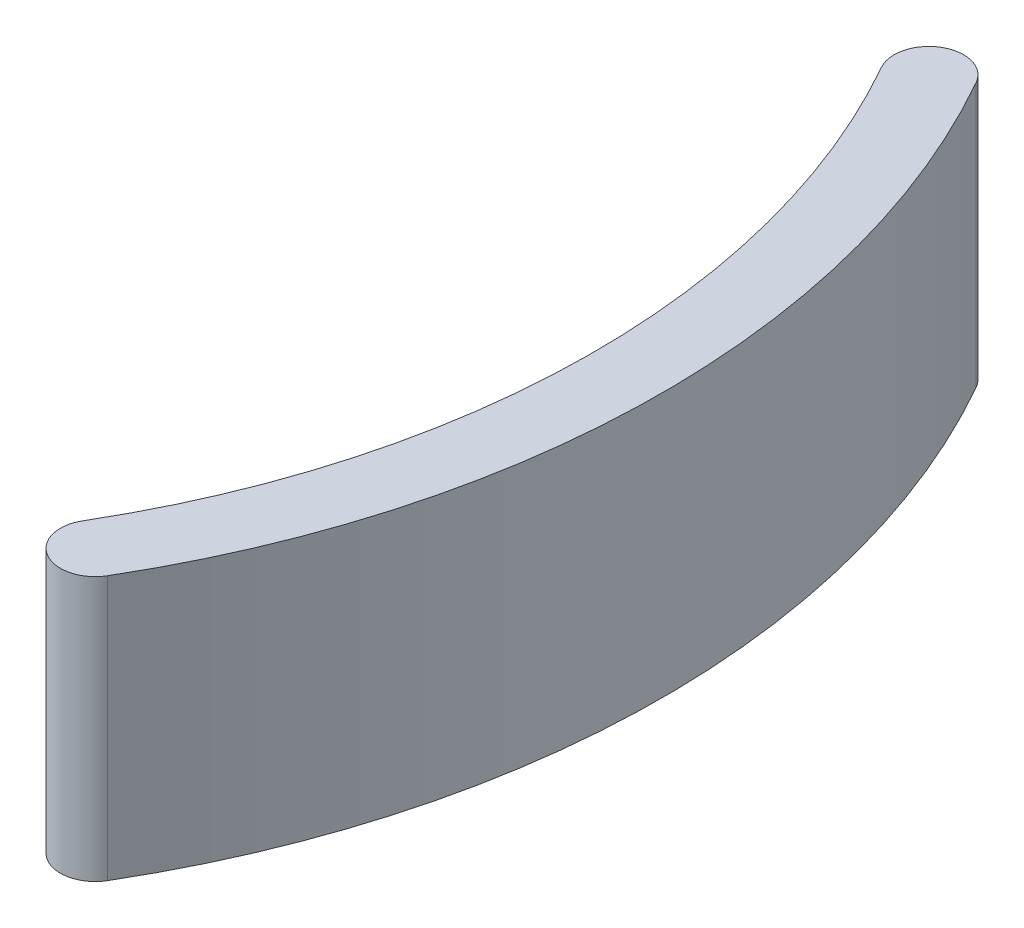
ISO-10303-21;
HEADER;
FILE_DESCRIPTION(('STEP AP214'),'2;1');
FILE_NAME('part.step','',(''),(''),'','','');
FILE_SCHEMA(('AUTOMOTIVE_DESIGN { 1 0 10303 214 1 1 1 1 }'));
ENDSEC;
DATA;
#1=APPLICATION_CONTEXT('core data for automotive mechanical design processes');
#2=APPLICATION_PROTOCOL_DEFINITION('international standard','automotive_design',2000,#1);
#3=PRODUCT_CONTEXT('',#1,'mechanical');
#4=PRODUCT('Part','Part','',(#3));
#5=PRODUCT_RELATED_PRODUCT_CATEGORY('part','',(#4));
#6=PRODUCT_DEFINITION_FORMATION('','',#4);
#7=PRODUCT_DEFINITION_CONTEXT('part definition',#1,'design');
#8=PRODUCT_DEFINITION('design','',#6,#7);
#9=PRODUCT_DEFINITION_SHAPE('','',#8);
#10=(LENGTH_UNIT() NAMED_UNIT(*) SI_UNIT(.MILLI.,.METRE.));
#11=(NAMED_UNIT(*) PLANE_ANGLE_UNIT() SI_UNIT($,.RADIAN.));
#12=(NAMED_UNIT(*) SI_UNIT($,.STERADIAN.) SOLID_ANGLE_UNIT());
#13=UNCERTAINTY_MEASURE_WITH_UNIT(LENGTH_MEASURE(1.E-05),#10,'distance_accuracy_value','');
#14=(GEOMETRIC_REPRESENTATION_CONTEXT(3) GLOBAL_UNCERTAINTY_ASSIGNED_CONTEXT((#13)) GLOBAL_UNIT_ASSIGNED_CONTEXT((#10,
#11,#12)) REPRESENTATION_CONTEXT('',''));
#15=CARTESIAN_POINT('',(0.,0.,0.));
#16=DIRECTION('',(0.,0.,1.));
#17=DIRECTION('',(1.,0.,0.));
#18=AXIS2_PLACEMENT_3D('',#15,#16,#17);
#19=CARTESIAN_POINT('',(-118.995988209902,38.,-0.977133536861125));
#20=DIRECTION('',(0.,-1.,0.));
#21=DIRECTION('',(0.,0.,-1.));
#22=AXIS2_PLACEMENT_3D('',#19,#20,#21);
#23=CYLINDRICAL_SURFACE('',#22,124.);
#24=CARTESIAN_POINT('',(-118.995988209902,0.,-0.977133536861125));
#25=DIRECTION('',(0.,1.,0.));
#26=DIRECTION('',(0.,0.,1.));
#27=AXIS2_PLACEMENT_3D('',#24,#25,#26);
#28=CIRCLE('',#27,124.);
#29=CARTESIAN_POINT('',(-12.1215532161835,0.,61.9025543183869));
#30=VERTEX_POINT('',#29);
#31=CARTESIAN_POINT('',(-11.1033636483618,0.,-62.0932653289054));
#32=VERTEX_POINT('',#31);
#33=EDGE_CURVE('E99',#30,#32,#28,.T.);
#34=ORIENTED_EDGE('',*,*,#33,.T.);
#35=DIRECTION('',(0.,-1.,0.));
#36=VECTOR('',#35,1.);
#37=CARTESIAN_POINT('',(-11.1033636483618,38.,-62.0932653289054));
#38=LINE('',#37,#36);
#39=CARTESIAN_POINT('',(-11.1033636483618,38.,-62.0932653289054));
#40=VERTEX_POINT('',#39);
#41=EDGE_CURVE('E11',#40,#32,#38,.T.);
#42=ORIENTED_EDGE('',*,*,#41,.F.);
#43=CARTESIAN_POINT('',(-118.995988209902,38.,-0.977133536861125));
#44=DIRECTION('',(0.,1.,0.));
#45=DIRECTION('',(0.,0.,1.));
#46=AXIS2_PLACEMENT_3D('',#43,#44,#45);
#47=CIRCLE('',#46,124.);
#48=CARTESIAN_POINT('',(-12.1215532161835,38.,61.9025543183869));
#49=VERTEX_POINT('',#48);
#50=EDGE_CURVE('E84',#49,#40,#47,.T.);
#51=ORIENTED_EDGE('',*,*,#50,.F.);
#52=DIRECTION('',(0.,-1.,0.));
#53=VECTOR('',#52,1.);
#54=CARTESIAN_POINT('',(-12.1215532161835,38.,61.9025543183869));
#55=LINE('',#54,#53);
#56=EDGE_CURVE('E95',#49,#30,#55,.T.);
#57=ORIENTED_EDGE('',*,*,#56,.T.);
#58=EDGE_LOOP('',(#34,#42,#51,#57));
#59=FACE_BOUND('',#58,.T.);
#60=ADVANCED_FACE('F37',(#59),#23,.T.);
#61=CARTESIAN_POINT('',(-15.4538727032626,38.,-59.6289051760004));
#62=DIRECTION('',(0.,-1.,0.));
#63=DIRECTION('',(0.,0.,-1.));
#64=AXIS2_PLACEMENT_3D('',#61,#62,#63);
#65=CYLINDRICAL_SURFACE('',#64,5.00000000000003);
#66=CARTESIAN_POINT('',(-15.4538727032626,0.,-59.6289051760004));
#67=DIRECTION('',(0.,1.,0.));
#68=DIRECTION('',(0.,0.,1.));
#69=AXIS2_PLACEMENT_3D('',#66,#67,#68);
#70=CIRCLE('',#69,5.00000000000003);
#71=CARTESIAN_POINT('',(-19.8043817581634,0.,-57.1645450230954));
#72=VERTEX_POINT('',#71);
#73=EDGE_CURVE('E89',#32,#72,#70,.T.);
#74=ORIENTED_EDGE('',*,*,#73,.T.);
#75=DIRECTION('',(0.,-1.,0.));
#76=VECTOR('',#75,1.);
#77=CARTESIAN_POINT('',(-19.8043817581634,38.,-57.1645450230954));
#78=LINE('',#77,#76);
#79=CARTESIAN_POINT('',(-19.8043817581634,38.,-57.1645450230954));
#80=VERTEX_POINT('',#79);
#81=EDGE_CURVE('E45',#80,#72,#78,.T.);
#82=ORIENTED_EDGE('',*,*,#81,.F.);
#83=CARTESIAN_POINT('',(-15.4538727032626,38.,-59.6289051760004));
#84=DIRECTION('',(0.,1.,0.));
#85=DIRECTION('',(0.,0.,1.));
#86=AXIS2_PLACEMENT_3D('',#83,#84,#85);
#87=CIRCLE('',#86,5.00000000000003);
#88=EDGE_CURVE('E79',#40,#80,#87,.T.);
#89=ORIENTED_EDGE('',*,*,#88,.F.);
#90=ORIENTED_EDGE('',*,*,#41,.T.);
#91=EDGE_LOOP('',(#74,#82,#89,#90));
#92=FACE_BOUND('',#91,.T.);
#93=ADVANCED_FACE('F88',(#92),#65,.T.);
#94=CARTESIAN_POINT('',(-118.995988209902,38.,-0.977133536861125));
#95=DIRECTION('',(0.,-1.,0.));
#96=DIRECTION('',(0.,0.,-1.));
#97=AXIS2_PLACEMENT_3D('',#94,#95,#96);
#98=CYLINDRICAL_SURFACE('',#97,114.);
#99=CARTESIAN_POINT('',(-118.995988209902,0.,-0.977133536861125));
#100=DIRECTION('',(0.,1.,0.));
#101=DIRECTION('',(0.,0.,1.));
#102=AXIS2_PLACEMENT_3D('',#99,#100,#101);
#103=CIRCLE('',#102,114.);
#104=CARTESIAN_POINT('',(-20.740459264064,0.,56.8316117494153));
#105=VERTEX_POINT('',#104);
#106=EDGE_CURVE('E103',#105,#72,#103,.T.);
#107=ORIENTED_EDGE('',*,*,#106,.F.);
#108=DIRECTION('',(0.,-1.,0.));
#109=VECTOR('',#108,1.);
#110=CARTESIAN_POINT('',(-20.740459264064,38.,56.8316117494153));
#111=LINE('',#110,#109);
#112=CARTESIAN_POINT('',(-20.740459264064,38.,56.8316117494153));
#113=VERTEX_POINT('',#112);
#114=EDGE_CURVE('E69',#113,#105,#111,.T.);
#115=ORIENTED_EDGE('',*,*,#114,.F.);
#116=CARTESIAN_POINT('',(-118.995988209902,38.,-0.977133536861125));
#117=DIRECTION('',(0.,1.,0.));
#118=DIRECTION('',(0.,0.,1.));
#119=AXIS2_PLACEMENT_3D('',#116,#117,#118);
#120=CIRCLE('',#119,114.);
#121=EDGE_CURVE('E82',#113,#80,#120,.T.);
#122=ORIENTED_EDGE('',*,*,#121,.T.);
#123=ORIENTED_EDGE('',*,*,#81,.T.);
#124=EDGE_LOOP('',(#107,#115,#122,#123));
#125=FACE_BOUND('',#124,.T.);
#126=ADVANCED_FACE('F93',(#125),#98,.F.);
#127=CARTESIAN_POINT('',(-16.4310062401237,38.,59.3670830339011));
#128=DIRECTION('',(0.,-1.,0.));
#129=DIRECTION('',(0.,0.,-1.));
#130=AXIS2_PLACEMENT_3D('',#127,#128,#129);
#131=CYLINDRICAL_SURFACE('',#130,5.00000000000004);
#132=CARTESIAN_POINT('',(-16.4310062401237,0.,59.3670830339011));
#133=DIRECTION('',(0.,1.,0.));
#134=DIRECTION('',(0.,0.,1.));
#135=AXIS2_PLACEMENT_3D('',#132,#133,#134);
#136=CIRCLE('',#135,5.00000000000004);
#137=EDGE_CURVE('E72',#105,#30,#136,.T.);
#138=ORIENTED_EDGE('',*,*,#137,.T.);
#139=ORIENTED_EDGE('',*,*,#56,.F.);
#140=CARTESIAN_POINT('',(-16.4310062401237,38.,59.3670830339011));
#141=DIRECTION('',(0.,1.,0.));
#142=DIRECTION('',(0.,0.,1.));
#143=AXIS2_PLACEMENT_3D('',#140,#141,#142);
#144=CIRCLE('',#143,5.00000000000004);
#145=EDGE_CURVE('E53',#113,#49,#144,.T.);
#146=ORIENTED_EDGE('',*,*,#145,.F.);
#147=ORIENTED_EDGE('',*,*,#114,.T.);
#148=EDGE_LOOP('',(#138,#139,#146,#147));
#149=FACE_BOUND('',#148,.T.);
#150=ADVANCED_FACE('F116',(#149),#131,.T.);
#151=CARTESIAN_POINT('',(0.,38.,0.));
#152=DIRECTION('',(0.,1.,0.));
#153=DIRECTION('',(0.,0.,1.));
#154=AXIS2_PLACEMENT_3D('',#151,#152,#153);
#155=PLANE('',#154);
#156=ORIENTED_EDGE('',*,*,#50,.T.);
#157=ORIENTED_EDGE('',*,*,#88,.T.);
#158=ORIENTED_EDGE('',*,*,#121,.F.);
#159=ORIENTED_EDGE('',*,*,#145,.T.);
#160=EDGE_LOOP('',(#156,#157,#158,#159));
#161=FACE_BOUND('',#160,.T.);
#162=ADVANCED_FACE('F80',(#161),#155,.T.);
#163=CARTESIAN_POINT('',(0.,0.,0.));
#164=DIRECTION('',(0.,1.,0.));
#165=DIRECTION('',(0.,0.,1.));
#166=AXIS2_PLACEMENT_3D('',#163,#164,#165);
#167=PLANE('',#166);
#168=ORIENTED_EDGE('',*,*,#33,.F.);
#169=ORIENTED_EDGE('',*,*,#137,.F.);
#170=ORIENTED_EDGE('',*,*,#106,.T.);
#171=ORIENTED_EDGE('',*,*,#73,.F.);
#172=EDGE_LOOP('',(#168,#169,#170,#171));
#173=FACE_BOUND('',#172,.T.);
#174=ADVANCED_FACE('F110',(#173),#167,.F.);
#175=CLOSED_SHELL('',(#60,#93,#126,#150,#162,#174));
#176=MANIFOLD_SOLID_BREP('B2',#175);
#177=ADVANCED_BREP_SHAPE_REPRESENTATION('',(#18,#176),#14);
#178=SHAPE_DEFINITION_REPRESENTATION(#9,#177);
ENDSEC;
END-ISO-10303-21;
